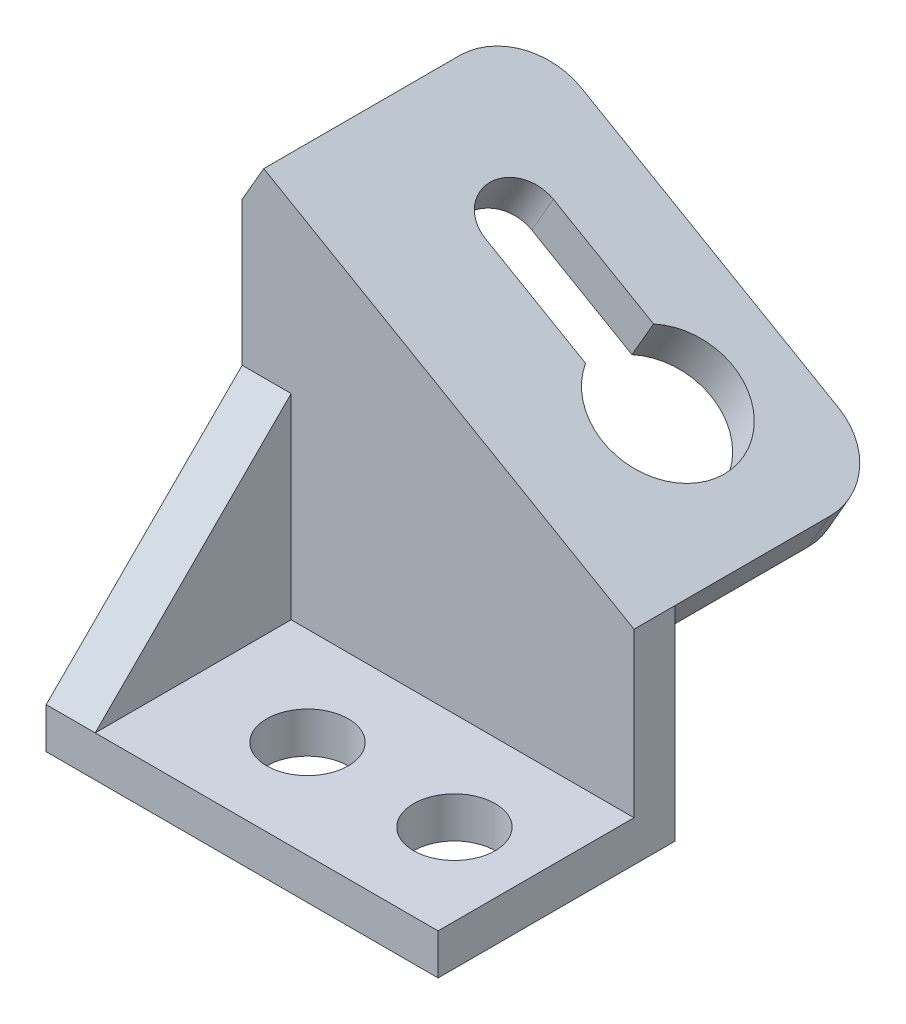
ISO-10303-21;
HEADER;
FILE_DESCRIPTION(('STEP AP214'),'2;1');
FILE_NAME('part.step','',(''),(''),'','','');
FILE_SCHEMA(('AUTOMOTIVE_DESIGN { 1 0 10303 214 1 1 1 1 }'));
ENDSEC;
DATA;
#1=APPLICATION_CONTEXT('core data for automotive mechanical design processes');
#2=APPLICATION_PROTOCOL_DEFINITION('international standard','automotive_design',2000,#1);
#3=PRODUCT_CONTEXT('',#1,'mechanical');
#4=PRODUCT('Part','Part','',(#3));
#5=PRODUCT_RELATED_PRODUCT_CATEGORY('part','',(#4));
#6=PRODUCT_DEFINITION_FORMATION('','',#4);
#7=PRODUCT_DEFINITION_CONTEXT('part definition',#1,'design');
#8=PRODUCT_DEFINITION('design','',#6,#7);
#9=PRODUCT_DEFINITION_SHAPE('','',#8);
#10=(LENGTH_UNIT() NAMED_UNIT(*) SI_UNIT(.MILLI.,.METRE.));
#11=(NAMED_UNIT(*) PLANE_ANGLE_UNIT() SI_UNIT($,.RADIAN.));
#12=(NAMED_UNIT(*) SI_UNIT($,.STERADIAN.) SOLID_ANGLE_UNIT());
#13=UNCERTAINTY_MEASURE_WITH_UNIT(LENGTH_MEASURE(1.E-05),#10,'distance_accuracy_value','');
#14=(GEOMETRIC_REPRESENTATION_CONTEXT(3) GLOBAL_UNCERTAINTY_ASSIGNED_CONTEXT((#13)) GLOBAL_UNIT_ASSIGNED_CONTEXT((#10,
#11,#12)) REPRESENTATION_CONTEXT('',''));
#15=CARTESIAN_POINT('',(0.,0.,0.));
#16=DIRECTION('',(0.,0.,1.));
#17=DIRECTION('',(1.,0.,0.));
#18=AXIS2_PLACEMENT_3D('',#15,#16,#17);
#19=CARTESIAN_POINT('',(72.,0.,0.));
#20=DIRECTION('',(0.,-1.,0.));
#21=DIRECTION('',(0.,0.,-1.));
#22=AXIS2_PLACEMENT_3D('',#19,#20,#21);
#23=PLANE('',#22);
#24=CARTESIAN_POINT('',(30.,0.,18.));
#25=DIRECTION('',(0.,1.,0.));
#26=DIRECTION('',(0.,0.,1.));
#27=AXIS2_PLACEMENT_3D('',#24,#25,#26);
#28=CIRCLE('',#27,7.5);
#29=CARTESIAN_POINT('',(30.,0.,25.5));
#30=VERTEX_POINT('',#29);
#31=EDGE_CURVE('E325',#30,#30,#28,.T.);
#32=ORIENTED_EDGE('',*,*,#31,.F.);
#33=EDGE_LOOP('',(#32));
#34=FACE_BOUND('',#33,.T.);
#35=CARTESIAN_POINT('',(57.,0.,18.));
#36=DIRECTION('',(0.,1.,0.));
#37=DIRECTION('',(0.,0.,1.));
#38=AXIS2_PLACEMENT_3D('',#35,#36,#37);
#39=CIRCLE('',#38,7.50000000000001);
#40=CARTESIAN_POINT('',(57.,0.,25.5));
#41=VERTEX_POINT('',#40);
#42=EDGE_CURVE('E319',#41,#41,#39,.T.);
#43=ORIENTED_EDGE('',*,*,#42,.F.);
#44=EDGE_LOOP('',(#43));
#45=FACE_BOUND('',#44,.T.);
#46=DIRECTION('',(0.,0.,-1.));
#47=VECTOR('',#46,1.);
#48=CARTESIAN_POINT('',(8.99999999999999,0.,0.));
#49=LINE('',#48,#47);
#50=CARTESIAN_POINT('',(9.,0.,36.));
#51=VERTEX_POINT('',#50);
#52=CARTESIAN_POINT('',(8.99999999999999,0.,0.));
#53=VERTEX_POINT('',#52);
#54=EDGE_CURVE('E151',#51,#53,#49,.T.);
#55=ORIENTED_EDGE('',*,*,#54,.F.);
#56=DIRECTION('',(-1.,0.,0.));
#57=VECTOR('',#56,1.);
#58=CARTESIAN_POINT('',(72.,0.,36.));
#59=LINE('',#58,#57);
#60=CARTESIAN_POINT('',(72.,0.,36.));
#61=VERTEX_POINT('',#60);
#62=EDGE_CURVE('E261',#61,#51,#59,.T.);
#63=ORIENTED_EDGE('',*,*,#62,.F.);
#64=DIRECTION('',(0.,0.,1.));
#65=VECTOR('',#64,1.);
#66=CARTESIAN_POINT('',(72.,0.,0.));
#67=LINE('',#66,#65);
#68=CARTESIAN_POINT('',(72.,0.,0.));
#69=VERTEX_POINT('',#68);
#70=EDGE_CURVE('E230',#69,#61,#67,.T.);
#71=ORIENTED_EDGE('',*,*,#70,.F.);
#72=DIRECTION('',(-1.,0.,0.));
#73=VECTOR('',#72,1.);
#74=CARTESIAN_POINT('',(72.,0.,0.));
#75=LINE('',#74,#73);
#76=EDGE_CURVE('E246',#69,#53,#75,.T.);
#77=ORIENTED_EDGE('',*,*,#76,.T.);
#78=EDGE_LOOP('',(#55,#63,#71,#77));
#79=FACE_BOUND('',#78,.T.);
#80=ADVANCED_FACE('F30',(#34,#45,#79),#23,.F.);
#81=CARTESIAN_POINT('',(72.,0.,0.));
#82=DIRECTION('',(0.,0.,-1.));
#83=DIRECTION('',(-1.,0.,0.));
#84=AXIS2_PLACEMENT_3D('',#81,#82,#83);
#85=PLANE('',#84);
#86=DIRECTION('',(0.,-1.,0.));
#87=VECTOR('',#86,1.);
#88=CARTESIAN_POINT('',(0.,0.,0.));
#89=LINE('',#88,#87);
#90=CARTESIAN_POINT('',(0.,62.4037838582679,0.));
#91=VERTEX_POINT('',#90);
#92=CARTESIAN_POINT('',(0.,36.,0.));
#93=VERTEX_POINT('',#92);
#94=EDGE_CURVE('E170',#91,#93,#89,.T.);
#95=ORIENTED_EDGE('',*,*,#94,.T.);
#96=DIRECTION('',(-1.,0.,0.));
#97=VECTOR('',#96,1.);
#98=CARTESIAN_POINT('',(72.,36.,0.));
#99=LINE('',#98,#97);
#100=CARTESIAN_POINT('',(9.,36.,0.));
#101=VERTEX_POINT('',#100);
#102=EDGE_CURVE('E160',#93,#101,#99,.F.);
#103=ORIENTED_EDGE('',*,*,#102,.T.);
#104=DIRECTION('',(0.,1.,0.));
#105=VECTOR('',#104,1.);
#106=CARTESIAN_POINT('',(8.99999999999999,0.,0.));
#107=LINE('',#106,#105);
#108=EDGE_CURVE('E146',#53,#101,#107,.T.);
#109=ORIENTED_EDGE('',*,*,#108,.F.);
#110=ORIENTED_EDGE('',*,*,#76,.F.);
#111=DIRECTION('',(0.,-1.,0.));
#112=VECTOR('',#111,1.);
#113=CARTESIAN_POINT('',(72.,0.,0.));
#114=LINE('',#113,#112);
#115=CARTESIAN_POINT('',(72.,30.,0.));
#116=VERTEX_POINT('',#115);
#117=EDGE_CURVE('E244',#116,#69,#114,.T.);
#118=ORIENTED_EDGE('',*,*,#117,.F.);
#119=DIRECTION('',(0.866025403784438,-0.500000000000001,0.));
#120=VECTOR('',#119,1.);
#121=CARTESIAN_POINT('',(-24.770194647391,85.8702979292038,0.));
#122=LINE('',#121,#120);
#123=CARTESIAN_POINT('',(3.96874999999999,69.2778605008068,0.));
#124=VERTEX_POINT('',#123);
#125=EDGE_CURVE('E227',#124,#116,#122,.T.);
#126=ORIENTED_EDGE('',*,*,#125,.F.);
#127=DIRECTION('',(0.5,0.866025403784439,0.));
#128=VECTOR('',#127,1.);
#129=CARTESIAN_POINT('',(-9.02163105676666,46.7778605008067,0.));
#130=LINE('',#129,#128);
#131=EDGE_CURVE('E173',#91,#124,#130,.T.);
#132=ORIENTED_EDGE('',*,*,#131,.F.);
#133=EDGE_LOOP('',(#95,#103,#109,#110,#118,#126,#132));
#134=FACE_BOUND('',#133,.T.);
#135=ADVANCED_FACE('F167',(#134),#85,.F.);
#136=CARTESIAN_POINT('',(30.9903810567667,53.6769145362398,0.));
#137=DIRECTION('',(0.500000000000001,0.866025403784438,0.));
#138=DIRECTION('',(-0.866025403784438,0.500000000000001,0.));
#139=AXIS2_PLACEMENT_3D('',#136,#137,#138);
#140=PLANE('',#139);
#141=DIRECTION('',(0.,0.,1.));
#142=VECTOR('',#141,1.);
#143=CARTESIAN_POINT('',(3.96874999999999,69.2778605008068,0.));
#144=LINE('',#143,#142);
#145=CARTESIAN_POINT('',(3.96874999999999,69.2778605008068,-36.));
#146=VERTEX_POINT('',#145);
#147=EDGE_CURVE('E171',#146,#124,#144,.T.);
#148=ORIENTED_EDGE('',*,*,#147,.T.);
#149=ORIENTED_EDGE('',*,*,#125,.T.);
#150=DIRECTION('',(0.,0.,-1.));
#151=VECTOR('',#150,1.);
#152=CARTESIAN_POINT('',(72.,30.,0.));
#153=LINE('',#152,#151);
#154=CARTESIAN_POINT('',(72.,30.,-7.5));
#155=VERTEX_POINT('',#154);
#156=EDGE_CURVE('E241',#116,#155,#153,.T.);
#157=ORIENTED_EDGE('',*,*,#156,.T.);
#158=DIRECTION('',(0.,0.,-1.));
#159=VECTOR('',#158,1.);
#160=CARTESIAN_POINT('',(72.,30.,0.));
#161=LINE('',#160,#159);
#162=CARTESIAN_POINT('',(72.,30.,-36.));
#163=VERTEX_POINT('',#162);
#164=EDGE_CURVE('E205',#155,#163,#161,.T.);
#165=ORIENTED_EDGE('',*,*,#164,.T.);
#166=CARTESIAN_POINT('',(61.6076951545867,36.,-36.));
#167=DIRECTION('',(0.500000000000001,0.866025403784438,0.));
#168=DIRECTION('',(-0.866025403784438,0.500000000000001,0.));
#169=AXIS2_PLACEMENT_3D('',#166,#167,#168);
#170=CIRCLE('',#169,12.);
#171=CARTESIAN_POINT('',(61.6076951545868,36.,-48.));
#172=VERTEX_POINT('',#171);
#173=EDGE_CURVE('E274',#163,#172,#170,.T.);
#174=ORIENTED_EDGE('',*,*,#173,.T.);
#175=DIRECTION('',(-0.866025403784438,0.500000000000001,0.));
#176=VECTOR('',#175,1.);
#177=CARTESIAN_POINT('',(72.,30.,-48.));
#178=LINE('',#177,#176);
#179=CARTESIAN_POINT('',(14.3610548454133,63.2778605008069,-48.));
#180=VERTEX_POINT('',#179);
#181=EDGE_CURVE('E216',#172,#180,#178,.T.);
#182=ORIENTED_EDGE('',*,*,#181,.T.);
#183=CARTESIAN_POINT('',(14.3610548454132,63.2778605008068,-36.));
#184=DIRECTION('',(0.500000000000001,0.866025403784438,0.));
#185=DIRECTION('',(-0.866025403784438,0.500000000000001,0.));
#186=AXIS2_PLACEMENT_3D('',#183,#184,#185);
#187=CIRCLE('',#186,12.);
#188=EDGE_CURVE('E272',#180,#146,#187,.T.);
#189=ORIENTED_EDGE('',*,*,#188,.T.);
#190=EDGE_LOOP('',(#148,#149,#157,#165,#174,#182,#189));
#191=FACE_BOUND('',#190,.T.);
#192=CARTESIAN_POINT('',(23.9355900899637,57.7500000000001,-27.));
#193=DIRECTION('',(0.500000000000001,0.866025403784438,0.));
#194=DIRECTION('',(-0.866025403784438,0.500000000000001,0.));
#195=AXIS2_PLACEMENT_3D('',#192,#193,#194);
#196=CIRCLE('',#195,6.25000000000001);
#197=CARTESIAN_POINT('',(23.9355900899637,57.7500000000001,-33.25));
#198=VERTEX_POINT('',#197);
#199=CARTESIAN_POINT('',(23.9355900899637,57.7500000000001,-20.75));
#200=VERTEX_POINT('',#199);
#201=EDGE_CURVE('E179',#198,#200,#196,.T.);
#202=ORIENTED_EDGE('',*,*,#201,.F.);
#203=DIRECTION('',(-0.866025403784438,0.500000000000001,0.));
#204=VECTOR('',#203,1.);
#205=CARTESIAN_POINT('',(23.9355900899637,57.7500000000001,-33.25));
#206=LINE('',#205,#204);
#207=CARTESIAN_POINT('',(42.343912134709,47.121950312137,-33.25));
#208=VERTEX_POINT('',#207);
#209=EDGE_CURVE('E184',#208,#198,#206,.T.);
#210=ORIENTED_EDGE('',*,*,#209,.F.);
#211=CARTESIAN_POINT('',(51.2153903091735,42.,-27.));
#212=DIRECTION('',(0.500000000000001,0.866025403784438,0.));
#213=DIRECTION('',(-0.866025403784438,0.500000000000001,0.));
#214=AXIS2_PLACEMENT_3D('',#211,#212,#213);
#215=CIRCLE('',#214,12.);
#216=CARTESIAN_POINT('',(42.343912134709,47.121950312137,-20.75));
#217=VERTEX_POINT('',#216);
#218=EDGE_CURVE('E198',#217,#208,#215,.T.);
#219=ORIENTED_EDGE('',*,*,#218,.F.);
#220=DIRECTION('',(0.866025403784438,-0.500000000000001,0.));
#221=VECTOR('',#220,1.);
#222=CARTESIAN_POINT('',(23.9355900899637,57.7500000000001,-20.75));
#223=LINE('',#222,#221);
#224=EDGE_CURVE('E195',#200,#217,#223,.T.);
#225=ORIENTED_EDGE('',*,*,#224,.F.);
#226=EDGE_LOOP('',(#202,#210,#219,#225));
#227=FACE_BOUND('',#226,.T.);
#228=ADVANCED_FACE('F294',(#191,#227),#140,.T.);
#229=CARTESIAN_POINT('',(68.03125,23.125923357461,-48.));
#230=DIRECTION('',(0.,0.,-1.));
#231=DIRECTION('',(-1.,0.,0.));
#232=AXIS2_PLACEMENT_3D('',#229,#230,#231);
#233=PLANE('',#232);
#234=ORIENTED_EDGE('',*,*,#181,.F.);
#235=DIRECTION('',(0.500000000000001,0.866025403784438,0.));
#236=VECTOR('',#235,1.);
#237=CARTESIAN_POINT('',(57.6389451545867,29.1259233574611,-48.));
#238=LINE('',#237,#236);
#239=CARTESIAN_POINT('',(57.6389451545867,29.1259233574611,-48.));
#240=VERTEX_POINT('',#239);
#241=EDGE_CURVE('E279',#172,#240,#238,.F.);
#242=ORIENTED_EDGE('',*,*,#241,.T.);
#243=DIRECTION('',(-0.866025403784438,0.500000000000001,0.));
#244=VECTOR('',#243,1.);
#245=CARTESIAN_POINT('',(68.03125,23.125923357461,-48.));
#246=LINE('',#245,#244);
#247=CARTESIAN_POINT('',(10.3923048454133,56.4037838582679,-48.));
#248=VERTEX_POINT('',#247);
#249=EDGE_CURVE('E215',#240,#248,#246,.T.);
#250=ORIENTED_EDGE('',*,*,#249,.T.);
#251=DIRECTION('',(0.5,0.866025403784439,0.));
#252=VECTOR('',#251,1.);
#253=CARTESIAN_POINT('',(10.3923048454132,56.4037838582678,-48.));
#254=LINE('',#253,#252);
#255=EDGE_CURVE('E276',#248,#180,#254,.T.);
#256=ORIENTED_EDGE('',*,*,#255,.T.);
#257=EDGE_LOOP('',(#234,#242,#250,#256));
#258=FACE_BOUND('',#257,.T.);
#259=ADVANCED_FACE('F297',(#258),#233,.T.);
#260=CARTESIAN_POINT('',(68.03125,23.125923357461,-48.));
#261=DIRECTION('',(0.500000000000001,0.866025403784438,0.));
#262=DIRECTION('',(-0.866025403784438,0.500000000000001,0.));
#263=AXIS2_PLACEMENT_3D('',#260,#261,#262);
#264=PLANE('',#263);
#265=DIRECTION('',(-0.866025403784438,0.500000000000001,0.));
#266=VECTOR('',#265,1.);
#267=CARTESIAN_POINT('',(19.9668400899637,50.8759233574611,-33.25));
#268=LINE('',#267,#266);
#269=CARTESIAN_POINT('',(38.375162134709,40.2478736695981,-33.25));
#270=VERTEX_POINT('',#269);
#271=CARTESIAN_POINT('',(19.9668400899637,50.8759233574611,-33.25));
#272=VERTEX_POINT('',#271);
#273=EDGE_CURVE('E190',#270,#272,#268,.T.);
#274=ORIENTED_EDGE('',*,*,#273,.T.);
#275=CARTESIAN_POINT('',(19.9668400899637,50.8759233574611,-27.));
#276=DIRECTION('',(0.500000000000001,0.866025403784438,0.));
#277=DIRECTION('',(-0.866025403784438,0.500000000000001,0.));
#278=AXIS2_PLACEMENT_3D('',#275,#276,#277);
#279=CIRCLE('',#278,6.25000000000001);
#280=CARTESIAN_POINT('',(19.9668400899637,50.8759233574611,-20.75));
#281=VERTEX_POINT('',#280);
#282=EDGE_CURVE('E180',#272,#281,#279,.T.);
#283=ORIENTED_EDGE('',*,*,#282,.T.);
#284=DIRECTION('',(0.866025403784438,-0.500000000000001,0.));
#285=VECTOR('',#284,1.);
#286=CARTESIAN_POINT('',(19.9668400899637,50.8759233574611,-20.75));
#287=LINE('',#286,#285);
#288=CARTESIAN_POINT('',(38.375162134709,40.2478736695981,-20.75));
#289=VERTEX_POINT('',#288);
#290=EDGE_CURVE('E183',#281,#289,#287,.T.);
#291=ORIENTED_EDGE('',*,*,#290,.T.);
#292=CARTESIAN_POINT('',(47.2466403091735,35.1259233574611,-27.));
#293=DIRECTION('',(0.500000000000001,0.866025403784438,0.));
#294=DIRECTION('',(-0.866025403784438,0.500000000000001,0.));
#295=AXIS2_PLACEMENT_3D('',#292,#293,#294);
#296=CIRCLE('',#295,12.);
#297=EDGE_CURVE('E187',#289,#270,#296,.T.);
#298=ORIENTED_EDGE('',*,*,#297,.T.);
#299=EDGE_LOOP('',(#274,#283,#291,#298));
#300=FACE_BOUND('',#299,.T.);
#301=DIRECTION('',(0.866025403784438,-0.500000000000001,0.));
#302=VECTOR('',#301,1.);
#303=CARTESIAN_POINT('',(81.0216310567666,15.625923357461,-7.5));
#304=LINE('',#303,#302);
#305=CARTESIAN_POINT('',(0.,62.4037838582679,-7.5));
#306=VERTEX_POINT('',#305);
#307=CARTESIAN_POINT('',(68.03125,23.1259233574611,-7.5));
#308=VERTEX_POINT('',#307);
#309=EDGE_CURVE('E224',#306,#308,#304,.T.);
#310=ORIENTED_EDGE('',*,*,#309,.F.);
#311=DIRECTION('',(0.,0.,1.));
#312=VECTOR('',#311,1.);
#313=CARTESIAN_POINT('',(0.,62.4037838582679,-48.));
#314=LINE('',#313,#312);
#315=CARTESIAN_POINT('',(0.,62.4037838582679,-36.));
#316=VERTEX_POINT('',#315);
#317=EDGE_CURVE('E267',#316,#306,#314,.T.);
#318=ORIENTED_EDGE('',*,*,#317,.F.);
#319=CARTESIAN_POINT('',(10.3923048454133,56.4037838582679,-36.));
#320=DIRECTION('',(0.500000000000001,0.866025403784438,0.));
#321=DIRECTION('',(-0.866025403784438,0.500000000000001,0.));
#322=AXIS2_PLACEMENT_3D('',#319,#320,#321);
#323=CIRCLE('',#322,12.);
#324=EDGE_CURVE('E50',#316,#248,#323,.F.);
#325=ORIENTED_EDGE('',*,*,#324,.T.);
#326=ORIENTED_EDGE('',*,*,#249,.F.);
#327=CARTESIAN_POINT('',(57.6389451545867,29.1259233574611,-36.));
#328=DIRECTION('',(0.500000000000001,0.866025403784438,0.));
#329=DIRECTION('',(-0.866025403784438,0.500000000000001,0.));
#330=AXIS2_PLACEMENT_3D('',#327,#328,#329);
#331=CIRCLE('',#330,12.);
#332=CARTESIAN_POINT('',(68.03125,23.1259233574611,-36.));
#333=VERTEX_POINT('',#332);
#334=EDGE_CURVE('E38',#240,#333,#331,.F.);
#335=ORIENTED_EDGE('',*,*,#334,.T.);
#336=DIRECTION('',(0.,0.,-1.));
#337=VECTOR('',#336,1.);
#338=CARTESIAN_POINT('',(68.03125,23.1259233574611,0.));
#339=LINE('',#338,#337);
#340=EDGE_CURVE('E212',#308,#333,#339,.T.);
#341=ORIENTED_EDGE('',*,*,#340,.F.);
#342=EDGE_LOOP('',(#310,#318,#325,#326,#335,#341));
#343=FACE_BOUND('',#342,.T.);
#344=ADVANCED_FACE('F284',(#300,#343),#264,.F.);
#345=CARTESIAN_POINT('',(0.,0.,36.));
#346=DIRECTION('',(-1.,0.,0.));
#347=DIRECTION('',(0.,0.,1.));
#348=AXIS2_PLACEMENT_3D('',#345,#346,#347);
#349=PLANE('',#348);
#350=DIRECTION('',(0.,-0.707106781186548,0.707106781186547));
#351=VECTOR('',#350,1.);
#352=CARTESIAN_POINT('',(0.,36.,0.));
#353=LINE('',#352,#351);
#354=CARTESIAN_POINT('',(0.,0.,36.));
#355=VERTEX_POINT('',#354);
#356=EDGE_CURVE('E163',#93,#355,#353,.T.);
#357=ORIENTED_EDGE('',*,*,#356,.F.);
#358=ORIENTED_EDGE('',*,*,#94,.F.);
#359=DIRECTION('',(0.,0.,-1.));
#360=VECTOR('',#359,1.);
#361=CARTESIAN_POINT('',(0.,62.4037838582679,36.));
#362=LINE('',#361,#360);
#363=EDGE_CURVE('E264',#91,#306,#362,.T.);
#364=ORIENTED_EDGE('',*,*,#363,.T.);
#365=DIRECTION('',(0.,1.,0.));
#366=VECTOR('',#365,1.);
#367=CARTESIAN_POINT('',(0.,0.,-7.5));
#368=LINE('',#367,#366);
#369=CARTESIAN_POINT('',(0.,-7.5,-7.5));
#370=VERTEX_POINT('',#369);
#371=EDGE_CURVE('E252',#306,#370,#368,.F.);
#372=ORIENTED_EDGE('',*,*,#371,.T.);
#373=DIRECTION('',(0.,0.,1.));
#374=VECTOR('',#373,1.);
#375=CARTESIAN_POINT('',(0.,-7.5,0.));
#376=LINE('',#375,#374);
#377=CARTESIAN_POINT('',(0.,-7.50000000000001,36.));
#378=VERTEX_POINT('',#377);
#379=EDGE_CURVE('E249',#370,#378,#376,.T.);
#380=ORIENTED_EDGE('',*,*,#379,.T.);
#381=DIRECTION('',(0.,1.,0.));
#382=VECTOR('',#381,1.);
#383=CARTESIAN_POINT('',(0.,-7.50000000000001,36.));
#384=LINE('',#383,#382);
#385=EDGE_CURVE('E229',#378,#355,#384,.T.);
#386=ORIENTED_EDGE('',*,*,#385,.T.);
#387=EDGE_LOOP('',(#357,#358,#364,#372,#380,#386));
#388=FACE_BOUND('',#387,.T.);
#389=ADVANCED_FACE('F314',(#388),#349,.T.);
#390=CARTESIAN_POINT('',(72.,-7.50000000000001,36.));
#391=DIRECTION('',(0.,0.,1.));
#392=DIRECTION('',(1.,0.,0.));
#393=AXIS2_PLACEMENT_3D('',#390,#391,#392);
#394=PLANE('',#393);
#395=ORIENTED_EDGE('',*,*,#385,.F.);
#396=DIRECTION('',(-1.,0.,0.));
#397=VECTOR('',#396,1.);
#398=CARTESIAN_POINT('',(72.,-7.50000000000001,36.));
#399=LINE('',#398,#397);
#400=CARTESIAN_POINT('',(72.,-7.50000000000001,36.));
#401=VERTEX_POINT('',#400);
#402=EDGE_CURVE('E259',#401,#378,#399,.T.);
#403=ORIENTED_EDGE('',*,*,#402,.F.);
#404=DIRECTION('',(0.,1.,0.));
#405=VECTOR('',#404,1.);
#406=CARTESIAN_POINT('',(72.,-7.50000000000001,36.));
#407=LINE('',#406,#405);
#408=EDGE_CURVE('E232',#401,#61,#407,.T.);
#409=ORIENTED_EDGE('',*,*,#408,.T.);
#410=ORIENTED_EDGE('',*,*,#62,.T.);
#411=DIRECTION('',(1.,0.,0.));
#412=VECTOR('',#411,1.);
#413=CARTESIAN_POINT('',(72.,0.,36.));
#414=LINE('',#413,#412);
#415=EDGE_CURVE('E156',#51,#355,#414,.F.);
#416=ORIENTED_EDGE('',*,*,#415,.T.);
#417=EDGE_LOOP('',(#395,#403,#409,#410,#416));
#418=FACE_BOUND('',#417,.T.);
#419=ADVANCED_FACE('F349',(#418),#394,.T.);
#420=CARTESIAN_POINT('',(72.,-7.5,0.));
#421=DIRECTION('',(0.,-1.,0.));
#422=DIRECTION('',(0.,0.,-1.));
#423=AXIS2_PLACEMENT_3D('',#420,#421,#422);
#424=PLANE('',#423);
#425=CARTESIAN_POINT('',(30.,-7.50000000000001,18.));
#426=DIRECTION('',(0.,1.,0.));
#427=DIRECTION('',(0.,0.,1.));
#428=AXIS2_PLACEMENT_3D('',#425,#426,#427);
#429=CIRCLE('',#428,7.5);
#430=CARTESIAN_POINT('',(30.,-7.50000000000001,25.5));
#431=VERTEX_POINT('',#430);
#432=EDGE_CURVE('E322',#431,#431,#429,.T.);
#433=ORIENTED_EDGE('',*,*,#432,.T.);
#434=EDGE_LOOP('',(#433));
#435=FACE_BOUND('',#434,.T.);
#436=CARTESIAN_POINT('',(57.,-7.50000000000001,18.));
#437=DIRECTION('',(0.,1.,0.));
#438=DIRECTION('',(0.,0.,1.));
#439=AXIS2_PLACEMENT_3D('',#436,#437,#438);
#440=CIRCLE('',#439,7.50000000000001);
#441=CARTESIAN_POINT('',(57.,-7.50000000000001,25.5));
#442=VERTEX_POINT('',#441);
#443=EDGE_CURVE('E164',#442,#442,#440,.T.);
#444=ORIENTED_EDGE('',*,*,#443,.T.);
#445=EDGE_LOOP('',(#444));
#446=FACE_BOUND('',#445,.T.);
#447=ORIENTED_EDGE('',*,*,#379,.F.);
#448=DIRECTION('',(-1.,0.,0.));
#449=VECTOR('',#448,1.);
#450=CARTESIAN_POINT('',(72.,-7.5,-7.5));
#451=LINE('',#450,#449);
#452=CARTESIAN_POINT('',(72.,-7.5,-7.5));
#453=VERTEX_POINT('',#452);
#454=EDGE_CURVE('E256',#453,#370,#451,.T.);
#455=ORIENTED_EDGE('',*,*,#454,.F.);
#456=DIRECTION('',(0.,0.,1.));
#457=VECTOR('',#456,1.);
#458=CARTESIAN_POINT('',(72.,-7.5,0.));
#459=LINE('',#458,#457);
#460=EDGE_CURVE('E235',#453,#401,#459,.T.);
#461=ORIENTED_EDGE('',*,*,#460,.T.);
#462=ORIENTED_EDGE('',*,*,#402,.T.);
#463=EDGE_LOOP('',(#447,#455,#461,#462));
#464=FACE_BOUND('',#463,.T.);
#465=ADVANCED_FACE('F331',(#435,#446,#464),#424,.T.);
#466=CARTESIAN_POINT('',(72.,0.,-7.5));
#467=DIRECTION('',(0.,0.,-1.));
#468=DIRECTION('',(-1.,0.,0.));
#469=AXIS2_PLACEMENT_3D('',#466,#467,#468);
#470=PLANE('',#469);
#471=ORIENTED_EDGE('',*,*,#454,.T.);
#472=ORIENTED_EDGE('',*,*,#371,.F.);
#473=ORIENTED_EDGE('',*,*,#309,.T.);
#474=DIRECTION('',(-0.500000000000001,-0.866025403784438,0.));
#475=VECTOR('',#474,1.);
#476=CARTESIAN_POINT('',(59.0096189432334,7.50000000000003,-7.5));
#477=LINE('',#476,#475);
#478=EDGE_CURVE('E218',#155,#308,#477,.T.);
#479=ORIENTED_EDGE('',*,*,#478,.F.);
#480=DIRECTION('',(0.,1.,0.));
#481=VECTOR('',#480,1.);
#482=CARTESIAN_POINT('',(72.,0.,-7.5));
#483=LINE('',#482,#481);
#484=EDGE_CURVE('E238',#155,#453,#483,.F.);
#485=ORIENTED_EDGE('',*,*,#484,.T.);
#486=EDGE_LOOP('',(#471,#472,#473,#479,#485));
#487=FACE_BOUND('',#486,.T.);
#488=ADVANCED_FACE('F310',(#487),#470,.T.);
#489=CARTESIAN_POINT('',(72.,0.,36.));
#490=DIRECTION('',(-1.,0.,0.));
#491=DIRECTION('',(0.,0.,1.));
#492=AXIS2_PLACEMENT_3D('',#489,#490,#491);
#493=PLANE('',#492);
#494=ORIENTED_EDGE('',*,*,#70,.T.);
#495=ORIENTED_EDGE('',*,*,#408,.F.);
#496=ORIENTED_EDGE('',*,*,#460,.F.);
#497=ORIENTED_EDGE('',*,*,#484,.F.);
#498=ORIENTED_EDGE('',*,*,#156,.F.);
#499=ORIENTED_EDGE('',*,*,#117,.T.);
#500=EDGE_LOOP('',(#494,#495,#496,#497,#498,#499));
#501=FACE_BOUND('',#500,.T.);
#502=ADVANCED_FACE('F306',(#501),#493,.F.);
#503=CARTESIAN_POINT('',(68.03125,23.1259233574611,0.));
#504=DIRECTION('',(0.866025403784438,-0.500000000000001,0.));
#505=DIRECTION('',(0.500000000000001,0.866025403784438,0.));
#506=AXIS2_PLACEMENT_3D('',#503,#504,#505);
#507=PLANE('',#506);
#508=ORIENTED_EDGE('',*,*,#340,.T.);
#509=DIRECTION('',(0.500000000000001,0.866025403784438,0.));
#510=VECTOR('',#509,1.);
#511=CARTESIAN_POINT('',(68.03125,23.1259233574611,-36.));
#512=LINE('',#511,#510);
#513=EDGE_CURVE('E269',#333,#163,#512,.T.);
#514=ORIENTED_EDGE('',*,*,#513,.T.);
#515=ORIENTED_EDGE('',*,*,#164,.F.);
#516=ORIENTED_EDGE('',*,*,#478,.T.);
#517=EDGE_LOOP('',(#508,#514,#515,#516));
#518=FACE_BOUND('',#517,.T.);
#519=ADVANCED_FACE('F289',(#518),#507,.T.);
#520=CARTESIAN_POINT('',(19.9668400899637,50.8759233574611,-27.));
#521=DIRECTION('',(0.500000000000001,0.866025403784438,0.));
#522=DIRECTION('',(-0.866025403784438,0.500000000000001,0.));
#523=AXIS2_PLACEMENT_3D('',#520,#521,#522);
#524=CYLINDRICAL_SURFACE('',#523,6.25000000000001);
#525=ORIENTED_EDGE('',*,*,#201,.T.);
#526=DIRECTION('',(0.500000000000001,0.866025403784438,0.));
#527=VECTOR('',#526,1.);
#528=CARTESIAN_POINT('',(19.9668400899637,50.8759233574611,-20.75));
#529=LINE('',#528,#527);
#530=EDGE_CURVE('E193',#281,#200,#529,.T.);
#531=ORIENTED_EDGE('',*,*,#530,.F.);
#532=ORIENTED_EDGE('',*,*,#282,.F.);
#533=DIRECTION('',(0.500000000000001,0.866025403784438,0.));
#534=VECTOR('',#533,1.);
#535=CARTESIAN_POINT('',(19.9668400899637,50.8759233574611,-33.25));
#536=LINE('',#535,#534);
#537=EDGE_CURVE('E203',#272,#198,#536,.T.);
#538=ORIENTED_EDGE('',*,*,#537,.T.);
#539=EDGE_LOOP('',(#525,#531,#532,#538));
#540=FACE_BOUND('',#539,.T.);
#541=ADVANCED_FACE('F379',(#540),#524,.F.);
#542=CARTESIAN_POINT('',(19.9668400899637,50.8759233574611,-33.25));
#543=DIRECTION('',(0.,0.,-1.));
#544=DIRECTION('',(-1.,0.,0.));
#545=AXIS2_PLACEMENT_3D('',#542,#543,#544);
#546=PLANE('',#545);
#547=ORIENTED_EDGE('',*,*,#209,.T.);
#548=ORIENTED_EDGE('',*,*,#537,.F.);
#549=ORIENTED_EDGE('',*,*,#273,.F.);
#550=DIRECTION('',(0.500000000000001,0.866025403784438,0.));
#551=VECTOR('',#550,1.);
#552=CARTESIAN_POINT('',(38.375162134709,40.2478736695981,-33.25));
#553=LINE('',#552,#551);
#554=EDGE_CURVE('E206',#270,#208,#553,.T.);
#555=ORIENTED_EDGE('',*,*,#554,.T.);
#556=EDGE_LOOP('',(#547,#548,#549,#555));
#557=FACE_BOUND('',#556,.T.);
#558=ADVANCED_FACE('F376',(#557),#546,.F.);
#559=CARTESIAN_POINT('',(47.2466403091735,35.1259233574611,-27.));
#560=DIRECTION('',(0.500000000000001,0.866025403784438,0.));
#561=DIRECTION('',(-0.866025403784438,0.500000000000001,0.));
#562=AXIS2_PLACEMENT_3D('',#559,#560,#561);
#563=CYLINDRICAL_SURFACE('',#562,12.);
#564=ORIENTED_EDGE('',*,*,#218,.T.);
#565=ORIENTED_EDGE('',*,*,#554,.F.);
#566=ORIENTED_EDGE('',*,*,#297,.F.);
#567=DIRECTION('',(0.500000000000001,0.866025403784438,0.));
#568=VECTOR('',#567,1.);
#569=CARTESIAN_POINT('',(38.375162134709,40.2478736695981,-20.75));
#570=LINE('',#569,#568);
#571=EDGE_CURVE('E208',#289,#217,#570,.T.);
#572=ORIENTED_EDGE('',*,*,#571,.T.);
#573=EDGE_LOOP('',(#564,#565,#566,#572));
#574=FACE_BOUND('',#573,.T.);
#575=ADVANCED_FACE('F370',(#574),#563,.F.);
#576=CARTESIAN_POINT('',(19.9668400899637,50.8759233574611,-20.75));
#577=DIRECTION('',(0.,0.,1.));
#578=DIRECTION('',(1.,0.,0.));
#579=AXIS2_PLACEMENT_3D('',#576,#577,#578);
#580=PLANE('',#579);
#581=ORIENTED_EDGE('',*,*,#224,.T.);
#582=ORIENTED_EDGE('',*,*,#571,.F.);
#583=ORIENTED_EDGE('',*,*,#290,.F.);
#584=ORIENTED_EDGE('',*,*,#530,.T.);
#585=EDGE_LOOP('',(#581,#582,#583,#584));
#586=FACE_BOUND('',#585,.T.);
#587=ADVANCED_FACE('F365',(#586),#580,.F.);
#588=CARTESIAN_POINT('',(0.,62.4037838582679,172.659312439748));
#589=DIRECTION('',(-0.866025403784439,0.5,0.));
#590=DIRECTION('',(-0.5,-0.866025403784439,0.));
#591=AXIS2_PLACEMENT_3D('',#588,#589,#590);
#592=PLANE('',#591);
#593=ORIENTED_EDGE('',*,*,#131,.T.);
#594=ORIENTED_EDGE('',*,*,#147,.F.);
#595=DIRECTION('',(0.5,0.866025403784439,0.));
#596=VECTOR('',#595,1.);
#597=CARTESIAN_POINT('',(0.,62.4037838582679,-36.));
#598=LINE('',#597,#596);
#599=EDGE_CURVE('E11',#146,#316,#598,.F.);
#600=ORIENTED_EDGE('',*,*,#599,.T.);
#601=ORIENTED_EDGE('',*,*,#317,.T.);
#602=ORIENTED_EDGE('',*,*,#363,.F.);
#603=EDGE_LOOP('',(#593,#594,#600,#601,#602));
#604=FACE_BOUND('',#603,.T.);
#605=ADVANCED_FACE('F300',(#604),#592,.T.);
#606=CARTESIAN_POINT('',(57.6389451545867,29.1259233574611,-36.));
#607=DIRECTION('',(0.500000000000001,0.866025403784438,0.));
#608=DIRECTION('',(-0.866025403784438,0.500000000000001,0.));
#609=AXIS2_PLACEMENT_3D('',#606,#607,#608);
#610=CYLINDRICAL_SURFACE('',#609,12.);
#611=ORIENTED_EDGE('',*,*,#334,.F.);
#612=ORIENTED_EDGE('',*,*,#241,.F.);
#613=ORIENTED_EDGE('',*,*,#173,.F.);
#614=ORIENTED_EDGE('',*,*,#513,.F.);
#615=EDGE_LOOP('',(#611,#612,#613,#614));
#616=FACE_BOUND('',#615,.T.);
#617=ADVANCED_FACE('F291',(#616),#610,.T.);
#618=CARTESIAN_POINT('',(10.3923048454132,56.4037838582678,-36.));
#619=DIRECTION('',(0.5,0.866025403784439,0.));
#620=DIRECTION('',(-0.866025403784439,0.5,0.));
#621=AXIS2_PLACEMENT_3D('',#618,#619,#620);
#622=CYLINDRICAL_SURFACE('',#621,12.);
#623=ORIENTED_EDGE('',*,*,#599,.F.);
#624=ORIENTED_EDGE('',*,*,#188,.F.);
#625=ORIENTED_EDGE('',*,*,#255,.F.);
#626=ORIENTED_EDGE('',*,*,#324,.F.);
#627=EDGE_LOOP('',(#623,#624,#625,#626));
#628=FACE_BOUND('',#627,.T.);
#629=ADVANCED_FACE('F32',(#628),#622,.T.);
#630=CARTESIAN_POINT('',(0.,36.,0.));
#631=DIRECTION('',(0.,-0.707106781186547,-0.707106781186548));
#632=DIRECTION('',(0.,-0.707106781186548,0.707106781186547));
#633=AXIS2_PLACEMENT_3D('',#630,#631,#632);
#634=PLANE('',#633);
#635=ORIENTED_EDGE('',*,*,#102,.F.);
#636=ORIENTED_EDGE('',*,*,#356,.T.);
#637=ORIENTED_EDGE('',*,*,#415,.F.);
#638=DIRECTION('',(0.,-0.707106781186548,0.707106781186547));
#639=VECTOR('',#638,1.);
#640=CARTESIAN_POINT('',(9.,36.,0.));
#641=LINE('',#640,#639);
#642=EDGE_CURVE('E149',#101,#51,#641,.T.);
#643=ORIENTED_EDGE('',*,*,#642,.F.);
#644=EDGE_LOOP('',(#635,#636,#637,#643));
#645=FACE_BOUND('',#644,.T.);
#646=ADVANCED_FACE('F159',(#645),#634,.F.);
#647=CARTESIAN_POINT('',(9.,30.8889302504034,-6.));
#648=DIRECTION('',(-1.,0.,0.));
#649=DIRECTION('',(0.,0.,1.));
#650=AXIS2_PLACEMENT_3D('',#647,#648,#649);
#651=PLANE('',#650);
#652=ORIENTED_EDGE('',*,*,#54,.T.);
#653=ORIENTED_EDGE('',*,*,#108,.T.);
#654=ORIENTED_EDGE('',*,*,#642,.T.);
#655=EDGE_LOOP('',(#652,#653,#654));
#656=FACE_BOUND('',#655,.T.);
#657=ADVANCED_FACE('F148',(#656),#651,.F.);
#658=CARTESIAN_POINT('',(57.,-7.50000000000001,18.));
#659=DIRECTION('',(0.,1.,0.));
#660=DIRECTION('',(0.,0.,1.));
#661=AXIS2_PLACEMENT_3D('',#658,#659,#660);
#662=CYLINDRICAL_SURFACE('',#661,7.50000000000001);
#663=ORIENTED_EDGE('',*,*,#443,.F.);
#664=EDGE_LOOP('',(#663));
#665=FACE_BOUND('',#664,.T.);
#666=ORIENTED_EDGE('',*,*,#42,.T.);
#667=EDGE_LOOP('',(#666));
#668=FACE_BOUND('',#667,.T.);
#669=ADVANCED_FACE('F337',(#665,#668),#662,.F.);
#670=CARTESIAN_POINT('',(30.,-7.50000000000001,18.));
#671=DIRECTION('',(0.,1.,0.));
#672=DIRECTION('',(0.,0.,1.));
#673=AXIS2_PLACEMENT_3D('',#670,#671,#672);
#674=CYLINDRICAL_SURFACE('',#673,7.5);
#675=ORIENTED_EDGE('',*,*,#432,.F.);
#676=EDGE_LOOP('',(#675));
#677=FACE_BOUND('',#676,.T.);
#678=ORIENTED_EDGE('',*,*,#31,.T.);
#679=EDGE_LOOP('',(#678));
#680=FACE_BOUND('',#679,.T.);
#681=ADVANCED_FACE('F334',(#677,#680),#674,.F.);
#682=CLOSED_SHELL('',(#80,#135,#228,#259,#344,#389,#419,#465,#488,#502,#519,#541,#558,#575,#587,
#605,#617,#629,#646,#657,#669,#681));
#683=MANIFOLD_SOLID_BREP('B2',#682);
#684=ADVANCED_BREP_SHAPE_REPRESENTATION('',(#18,#683),#14);
#685=SHAPE_DEFINITION_REPRESENTATION(#9,#684);
ENDSEC;
END-ISO-10303-21;
